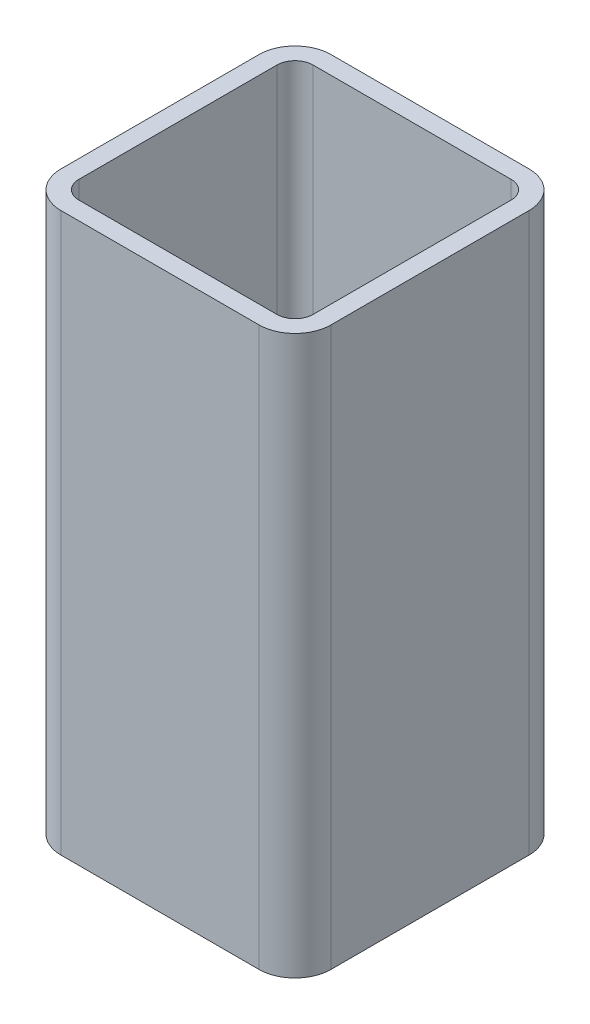
ISO-10303-21;
HEADER;
FILE_DESCRIPTION(('STEP AP214'),'2;1');
FILE_NAME('part.step','',(''),(''),'','','');
FILE_SCHEMA(('AUTOMOTIVE_DESIGN { 1 0 10303 214 1 1 1 1 }'));
ENDSEC;
DATA;
#1=APPLICATION_CONTEXT('core data for automotive mechanical design processes');
#2=APPLICATION_PROTOCOL_DEFINITION('international standard','automotive_design',2000,#1);
#3=PRODUCT_CONTEXT('',#1,'mechanical');
#4=PRODUCT('Part','Part','',(#3));
#5=PRODUCT_RELATED_PRODUCT_CATEGORY('part','',(#4));
#6=PRODUCT_DEFINITION_FORMATION('','',#4);
#7=PRODUCT_DEFINITION_CONTEXT('part definition',#1,'design');
#8=PRODUCT_DEFINITION('design','',#6,#7);
#9=PRODUCT_DEFINITION_SHAPE('','',#8);
#10=(LENGTH_UNIT() NAMED_UNIT(*) SI_UNIT(.MILLI.,.METRE.));
#11=(NAMED_UNIT(*) PLANE_ANGLE_UNIT() SI_UNIT($,.RADIAN.));
#12=(NAMED_UNIT(*) SI_UNIT($,.STERADIAN.) SOLID_ANGLE_UNIT());
#13=UNCERTAINTY_MEASURE_WITH_UNIT(LENGTH_MEASURE(1.E-05),#10,'distance_accuracy_value','');
#14=(GEOMETRIC_REPRESENTATION_CONTEXT(3) GLOBAL_UNCERTAINTY_ASSIGNED_CONTEXT((#13)) GLOBAL_UNIT_ASSIGNED_CONTEXT((#10,
#11,#12)) REPRESENTATION_CONTEXT('',''));
#15=CARTESIAN_POINT('',(0.,0.,0.));
#16=DIRECTION('',(0.,0.,1.));
#17=DIRECTION('',(1.,0.,0.));
#18=AXIS2_PLACEMENT_3D('',#15,#16,#17);
#19=CARTESIAN_POINT('',(4.,62.,-4.));
#20=DIRECTION('',(0.,-1.,0.));
#21=DIRECTION('',(0.,0.,-1.));
#22=AXIS2_PLACEMENT_3D('',#19,#20,#21);
#23=PLANE('',#22);
#24=CARTESIAN_POINT('',(4.,62.,-4.));
#25=DIRECTION('',(0.,1.,0.));
#26=DIRECTION('',(0.,0.,-1.));
#27=AXIS2_PLACEMENT_3D('',#24,#25,#26);
#28=CIRCLE('',#27,4.);
#29=CARTESIAN_POINT('',(0.,62.,-4.00000000000003));
#30=VERTEX_POINT('',#29);
#31=CARTESIAN_POINT('',(4.00000000000003,62.,0.));
#32=VERTEX_POINT('',#31);
#33=EDGE_CURVE('E213',#30,#32,#28,.T.);
#34=ORIENTED_EDGE('',*,*,#33,.T.);
#35=DIRECTION('',(1.,0.,0.));
#36=VECTOR('',#35,1.);
#37=CARTESIAN_POINT('',(4.00000000000003,62.,0.));
#38=LINE('',#37,#36);
#39=CARTESIAN_POINT('',(26.,62.,0.));
#40=VERTEX_POINT('',#39);
#41=EDGE_CURVE('E216',#32,#40,#38,.T.);
#42=ORIENTED_EDGE('',*,*,#41,.T.);
#43=CARTESIAN_POINT('',(26.,62.,-4.));
#44=DIRECTION('',(0.,1.,0.));
#45=DIRECTION('',(0.,0.,1.));
#46=AXIS2_PLACEMENT_3D('',#43,#44,#45);
#47=CIRCLE('',#46,4.);
#48=CARTESIAN_POINT('',(30.,62.,-4.00000000000003));
#49=VERTEX_POINT('',#48);
#50=EDGE_CURVE('E219',#40,#49,#47,.T.);
#51=ORIENTED_EDGE('',*,*,#50,.T.);
#52=DIRECTION('',(0.,0.,-1.));
#53=VECTOR('',#52,1.);
#54=CARTESIAN_POINT('',(30.,62.,-4.00000000000003));
#55=LINE('',#54,#53);
#56=CARTESIAN_POINT('',(30.,62.,-26.));
#57=VERTEX_POINT('',#56);
#58=EDGE_CURVE('E221',#49,#57,#55,.T.);
#59=ORIENTED_EDGE('',*,*,#58,.T.);
#60=CARTESIAN_POINT('',(26.,62.,-26.));
#61=DIRECTION('',(0.,1.,0.));
#62=DIRECTION('',(0.,0.,-1.));
#63=AXIS2_PLACEMENT_3D('',#60,#61,#62);
#64=CIRCLE('',#63,4.);
#65=CARTESIAN_POINT('',(26.,62.,-30.));
#66=VERTEX_POINT('',#65);
#67=EDGE_CURVE('E223',#57,#66,#64,.T.);
#68=ORIENTED_EDGE('',*,*,#67,.T.);
#69=DIRECTION('',(-1.,0.,0.));
#70=VECTOR('',#69,1.);
#71=CARTESIAN_POINT('',(4.00000000000003,62.,-30.));
#72=LINE('',#71,#70);
#73=CARTESIAN_POINT('',(4.00000000000003,62.,-30.));
#74=VERTEX_POINT('',#73);
#75=EDGE_CURVE('E225',#66,#74,#72,.T.);
#76=ORIENTED_EDGE('',*,*,#75,.T.);
#77=CARTESIAN_POINT('',(4.,62.,-26.));
#78=DIRECTION('',(0.,1.,0.));
#79=DIRECTION('',(0.,0.,-1.));
#80=AXIS2_PLACEMENT_3D('',#77,#78,#79);
#81=CIRCLE('',#80,4.);
#82=CARTESIAN_POINT('',(0.,62.,-26.));
#83=VERTEX_POINT('',#82);
#84=EDGE_CURVE('E227',#74,#83,#81,.T.);
#85=ORIENTED_EDGE('',*,*,#84,.T.);
#86=DIRECTION('',(0.,0.,1.));
#87=VECTOR('',#86,1.);
#88=CARTESIAN_POINT('',(0.,62.,-4.00000000000003));
#89=LINE('',#88,#87);
#90=EDGE_CURVE('E229',#83,#30,#89,.T.);
#91=ORIENTED_EDGE('',*,*,#90,.T.);
#92=EDGE_LOOP('',(#34,#42,#51,#59,#68,#76,#85,#91));
#93=FACE_BOUND('',#92,.T.);
#94=CARTESIAN_POINT('',(4.,62.,-4.));
#95=DIRECTION('',(0.,1.,0.));
#96=DIRECTION('',(0.,0.,-1.));
#97=AXIS2_PLACEMENT_3D('',#94,#95,#96);
#98=CIRCLE('',#97,2.);
#99=CARTESIAN_POINT('',(2.,62.,-4.00000000000003));
#100=VERTEX_POINT('',#99);
#101=CARTESIAN_POINT('',(4.00000000000003,62.,-2.));
#102=VERTEX_POINT('',#101);
#103=EDGE_CURVE('E148',#100,#102,#98,.T.);
#104=ORIENTED_EDGE('',*,*,#103,.F.);
#105=DIRECTION('',(0.,0.,1.));
#106=VECTOR('',#105,1.);
#107=CARTESIAN_POINT('',(2.,62.,-4.00000000000003));
#108=LINE('',#107,#106);
#109=CARTESIAN_POINT('',(2.,62.,-26.));
#110=VERTEX_POINT('',#109);
#111=EDGE_CURVE('E181',#110,#100,#108,.T.);
#112=ORIENTED_EDGE('',*,*,#111,.F.);
#113=CARTESIAN_POINT('',(4.,62.,-26.));
#114=DIRECTION('',(0.,1.,0.));
#115=DIRECTION('',(0.,0.,-1.));
#116=AXIS2_PLACEMENT_3D('',#113,#114,#115);
#117=CIRCLE('',#116,2.);
#118=CARTESIAN_POINT('',(4.00000000000003,62.,-28.));
#119=VERTEX_POINT('',#118);
#120=EDGE_CURVE('E179',#119,#110,#117,.T.);
#121=ORIENTED_EDGE('',*,*,#120,.F.);
#122=DIRECTION('',(-1.,0.,0.));
#123=VECTOR('',#122,1.);
#124=CARTESIAN_POINT('',(4.00000000000003,62.,-28.));
#125=LINE('',#124,#123);
#126=CARTESIAN_POINT('',(26.,62.,-28.));
#127=VERTEX_POINT('',#126);
#128=EDGE_CURVE('E177',#127,#119,#125,.T.);
#129=ORIENTED_EDGE('',*,*,#128,.F.);
#130=CARTESIAN_POINT('',(26.,62.,-26.));
#131=DIRECTION('',(0.,1.,0.));
#132=DIRECTION('',(0.,0.,-1.));
#133=AXIS2_PLACEMENT_3D('',#130,#131,#132);
#134=CIRCLE('',#133,2.);
#135=CARTESIAN_POINT('',(28.,62.,-26.));
#136=VERTEX_POINT('',#135);
#137=EDGE_CURVE('E175',#136,#127,#134,.T.);
#138=ORIENTED_EDGE('',*,*,#137,.F.);
#139=DIRECTION('',(0.,0.,-1.));
#140=VECTOR('',#139,1.);
#141=CARTESIAN_POINT('',(28.,62.,-4.00000000000001));
#142=LINE('',#141,#140);
#143=CARTESIAN_POINT('',(28.,62.,-4.00000000000001));
#144=VERTEX_POINT('',#143);
#145=EDGE_CURVE('E171',#144,#136,#142,.T.);
#146=ORIENTED_EDGE('',*,*,#145,.F.);
#147=CARTESIAN_POINT('',(26.,62.,-4.));
#148=DIRECTION('',(0.,1.,0.));
#149=DIRECTION('',(0.,0.,1.));
#150=AXIS2_PLACEMENT_3D('',#147,#148,#149);
#151=CIRCLE('',#150,2.);
#152=CARTESIAN_POINT('',(26.,62.,-2.));
#153=VERTEX_POINT('',#152);
#154=EDGE_CURVE('E169',#153,#144,#151,.T.);
#155=ORIENTED_EDGE('',*,*,#154,.F.);
#156=DIRECTION('',(1.,0.,0.));
#157=VECTOR('',#156,1.);
#158=CARTESIAN_POINT('',(4.00000000000003,62.,-2.));
#159=LINE('',#158,#157);
#160=EDGE_CURVE('E156',#102,#153,#159,.T.);
#161=ORIENTED_EDGE('',*,*,#160,.F.);
#162=EDGE_LOOP('',(#104,#112,#121,#129,#138,#146,#155,#161));
#163=FACE_BOUND('',#162,.T.);
#164=ADVANCED_FACE('F35',(#93,#163),#23,.F.);
#165=CARTESIAN_POINT('',(4.,0.,-4.));
#166=DIRECTION('',(0.,-1.,0.));
#167=DIRECTION('',(0.,0.,-1.));
#168=AXIS2_PLACEMENT_3D('',#165,#166,#167);
#169=PLANE('',#168);
#170=CARTESIAN_POINT('',(4.,0.,-4.));
#171=DIRECTION('',(0.,1.,0.));
#172=DIRECTION('',(0.,0.,-1.));
#173=AXIS2_PLACEMENT_3D('',#170,#171,#172);
#174=CIRCLE('',#173,4.);
#175=CARTESIAN_POINT('',(0.,0.,-4.00000000000003));
#176=VERTEX_POINT('',#175);
#177=CARTESIAN_POINT('',(4.00000000000003,0.,0.));
#178=VERTEX_POINT('',#177);
#179=EDGE_CURVE('E164',#176,#178,#174,.T.);
#180=ORIENTED_EDGE('',*,*,#179,.F.);
#181=DIRECTION('',(0.,0.,1.));
#182=VECTOR('',#181,1.);
#183=CARTESIAN_POINT('',(0.,0.,-4.00000000000003));
#184=LINE('',#183,#182);
#185=CARTESIAN_POINT('',(0.,0.,-26.));
#186=VERTEX_POINT('',#185);
#187=EDGE_CURVE('E217',#186,#176,#184,.T.);
#188=ORIENTED_EDGE('',*,*,#187,.F.);
#189=CARTESIAN_POINT('',(4.,0.,-26.));
#190=DIRECTION('',(0.,1.,0.));
#191=DIRECTION('',(0.,0.,-1.));
#192=AXIS2_PLACEMENT_3D('',#189,#190,#191);
#193=CIRCLE('',#192,4.);
#194=CARTESIAN_POINT('',(4.00000000000003,0.,-30.));
#195=VERTEX_POINT('',#194);
#196=EDGE_CURVE('E244',#195,#186,#193,.T.);
#197=ORIENTED_EDGE('',*,*,#196,.F.);
#198=DIRECTION('',(-1.,0.,0.));
#199=VECTOR('',#198,1.);
#200=CARTESIAN_POINT('',(4.00000000000003,0.,-30.));
#201=LINE('',#200,#199);
#202=CARTESIAN_POINT('',(26.,0.,-30.));
#203=VERTEX_POINT('',#202);
#204=EDGE_CURVE('E242',#203,#195,#201,.T.);
#205=ORIENTED_EDGE('',*,*,#204,.F.);
#206=CARTESIAN_POINT('',(26.,0.,-26.));
#207=DIRECTION('',(0.,1.,0.));
#208=DIRECTION('',(0.,0.,-1.));
#209=AXIS2_PLACEMENT_3D('',#206,#207,#208);
#210=CIRCLE('',#209,4.);
#211=CARTESIAN_POINT('',(30.,0.,-26.));
#212=VERTEX_POINT('',#211);
#213=EDGE_CURVE('E240',#212,#203,#210,.T.);
#214=ORIENTED_EDGE('',*,*,#213,.F.);
#215=DIRECTION('',(0.,0.,-1.));
#216=VECTOR('',#215,1.);
#217=CARTESIAN_POINT('',(30.,0.,-4.00000000000003));
#218=LINE('',#217,#216);
#219=CARTESIAN_POINT('',(30.,0.,-4.00000000000003));
#220=VERTEX_POINT('',#219);
#221=EDGE_CURVE('E238',#220,#212,#218,.T.);
#222=ORIENTED_EDGE('',*,*,#221,.F.);
#223=CARTESIAN_POINT('',(26.,0.,-4.));
#224=DIRECTION('',(0.,1.,0.));
#225=DIRECTION('',(0.,0.,1.));
#226=AXIS2_PLACEMENT_3D('',#223,#224,#225);
#227=CIRCLE('',#226,4.);
#228=CARTESIAN_POINT('',(26.,0.,0.));
#229=VERTEX_POINT('',#228);
#230=EDGE_CURVE('E236',#229,#220,#227,.T.);
#231=ORIENTED_EDGE('',*,*,#230,.F.);
#232=DIRECTION('',(1.,0.,0.));
#233=VECTOR('',#232,1.);
#234=CARTESIAN_POINT('',(4.00000000000003,0.,0.));
#235=LINE('',#234,#233);
#236=EDGE_CURVE('E234',#178,#229,#235,.T.);
#237=ORIENTED_EDGE('',*,*,#236,.F.);
#238=EDGE_LOOP('',(#180,#188,#197,#205,#214,#222,#231,#237));
#239=FACE_BOUND('',#238,.T.);
#240=DIRECTION('',(0.,0.,1.));
#241=VECTOR('',#240,1.);
#242=CARTESIAN_POINT('',(2.,0.,-4.00000000000003));
#243=LINE('',#242,#241);
#244=CARTESIAN_POINT('',(2.,0.,-26.));
#245=VERTEX_POINT('',#244);
#246=CARTESIAN_POINT('',(2.,0.,-4.00000000000003));
#247=VERTEX_POINT('',#246);
#248=EDGE_CURVE('E157',#245,#247,#243,.T.);
#249=ORIENTED_EDGE('',*,*,#248,.T.);
#250=CARTESIAN_POINT('',(4.,0.,-4.));
#251=DIRECTION('',(0.,1.,0.));
#252=DIRECTION('',(0.,0.,-1.));
#253=AXIS2_PLACEMENT_3D('',#250,#251,#252);
#254=CIRCLE('',#253,2.);
#255=CARTESIAN_POINT('',(4.00000000000003,0.,-2.));
#256=VERTEX_POINT('',#255);
#257=EDGE_CURVE('E58',#247,#256,#254,.T.);
#258=ORIENTED_EDGE('',*,*,#257,.T.);
#259=DIRECTION('',(1.,0.,0.));
#260=VECTOR('',#259,1.);
#261=CARTESIAN_POINT('',(4.00000000000003,0.,-2.));
#262=LINE('',#261,#260);
#263=CARTESIAN_POINT('',(26.,0.,-2.));
#264=VERTEX_POINT('',#263);
#265=EDGE_CURVE('E163',#256,#264,#262,.T.);
#266=ORIENTED_EDGE('',*,*,#265,.T.);
#267=CARTESIAN_POINT('',(26.,0.,-4.));
#268=DIRECTION('',(0.,1.,0.));
#269=DIRECTION('',(0.,0.,1.));
#270=AXIS2_PLACEMENT_3D('',#267,#268,#269);
#271=CIRCLE('',#270,2.);
#272=CARTESIAN_POINT('',(28.,0.,-4.00000000000001));
#273=VERTEX_POINT('',#272);
#274=EDGE_CURVE('E185',#264,#273,#271,.T.);
#275=ORIENTED_EDGE('',*,*,#274,.T.);
#276=DIRECTION('',(0.,0.,-1.));
#277=VECTOR('',#276,1.);
#278=CARTESIAN_POINT('',(28.,0.,-4.00000000000001));
#279=LINE('',#278,#277);
#280=CARTESIAN_POINT('',(28.,0.,-26.));
#281=VERTEX_POINT('',#280);
#282=EDGE_CURVE('E188',#273,#281,#279,.T.);
#283=ORIENTED_EDGE('',*,*,#282,.T.);
#284=CARTESIAN_POINT('',(26.,0.,-26.));
#285=DIRECTION('',(0.,1.,0.));
#286=DIRECTION('',(0.,0.,-1.));
#287=AXIS2_PLACEMENT_3D('',#284,#285,#286);
#288=CIRCLE('',#287,2.);
#289=CARTESIAN_POINT('',(26.,0.,-28.));
#290=VERTEX_POINT('',#289);
#291=EDGE_CURVE('E191',#281,#290,#288,.T.);
#292=ORIENTED_EDGE('',*,*,#291,.T.);
#293=DIRECTION('',(-1.,0.,0.));
#294=VECTOR('',#293,1.);
#295=CARTESIAN_POINT('',(4.00000000000003,0.,-28.));
#296=LINE('',#295,#294);
#297=CARTESIAN_POINT('',(4.00000000000003,0.,-28.));
#298=VERTEX_POINT('',#297);
#299=EDGE_CURVE('E194',#290,#298,#296,.T.);
#300=ORIENTED_EDGE('',*,*,#299,.T.);
#301=CARTESIAN_POINT('',(4.,0.,-26.));
#302=DIRECTION('',(0.,1.,0.));
#303=DIRECTION('',(0.,0.,-1.));
#304=AXIS2_PLACEMENT_3D('',#301,#302,#303);
#305=CIRCLE('',#304,2.);
#306=EDGE_CURVE('E197',#298,#245,#305,.T.);
#307=ORIENTED_EDGE('',*,*,#306,.T.);
#308=EDGE_LOOP('',(#249,#258,#266,#275,#283,#292,#300,#307));
#309=FACE_BOUND('',#308,.T.);
#310=ADVANCED_FACE('F274',(#239,#309),#169,.T.);
#311=CARTESIAN_POINT('',(4.,62.,-4.));
#312=DIRECTION('',(0.,-1.,0.));
#313=DIRECTION('',(0.,0.,-1.));
#314=AXIS2_PLACEMENT_3D('',#311,#312,#313);
#315=CYLINDRICAL_SURFACE('',#314,4.);
#316=ORIENTED_EDGE('',*,*,#179,.T.);
#317=DIRECTION('',(0.,-1.,0.));
#318=VECTOR('',#317,1.);
#319=CARTESIAN_POINT('',(4.00000000000003,62.,0.));
#320=LINE('',#319,#318);
#321=EDGE_CURVE('E11',#32,#178,#320,.T.);
#322=ORIENTED_EDGE('',*,*,#321,.F.);
#323=ORIENTED_EDGE('',*,*,#33,.F.);
#324=DIRECTION('',(0.,-1.,0.));
#325=VECTOR('',#324,1.);
#326=CARTESIAN_POINT('',(0.,62.,-4.00000000000003));
#327=LINE('',#326,#325);
#328=EDGE_CURVE('E231',#30,#176,#327,.T.);
#329=ORIENTED_EDGE('',*,*,#328,.T.);
#330=EDGE_LOOP('',(#316,#322,#323,#329));
#331=FACE_BOUND('',#330,.T.);
#332=ADVANCED_FACE('F37',(#331),#315,.T.);
#333=CARTESIAN_POINT('',(4.00000000000003,62.,0.));
#334=DIRECTION('',(0.,0.,-1.));
#335=DIRECTION('',(-1.,0.,0.));
#336=AXIS2_PLACEMENT_3D('',#333,#334,#335);
#337=PLANE('',#336);
#338=ORIENTED_EDGE('',*,*,#236,.T.);
#339=DIRECTION('',(0.,-1.,0.));
#340=VECTOR('',#339,1.);
#341=CARTESIAN_POINT('',(26.,62.,0.));
#342=LINE('',#341,#340);
#343=EDGE_CURVE('E43',#40,#229,#342,.T.);
#344=ORIENTED_EDGE('',*,*,#343,.F.);
#345=ORIENTED_EDGE('',*,*,#41,.F.);
#346=ORIENTED_EDGE('',*,*,#321,.T.);
#347=EDGE_LOOP('',(#338,#344,#345,#346));
#348=FACE_BOUND('',#347,.T.);
#349=ADVANCED_FACE('F291',(#348),#337,.F.);
#350=CARTESIAN_POINT('',(26.,62.,-4.));
#351=DIRECTION('',(0.,-1.,0.));
#352=DIRECTION('',(0.,0.,-1.));
#353=AXIS2_PLACEMENT_3D('',#350,#351,#352);
#354=CYLINDRICAL_SURFACE('',#353,4.);
#355=ORIENTED_EDGE('',*,*,#230,.T.);
#356=DIRECTION('',(0.,-1.,0.));
#357=VECTOR('',#356,1.);
#358=CARTESIAN_POINT('',(30.,62.,-4.00000000000003));
#359=LINE('',#358,#357);
#360=EDGE_CURVE('E261',#49,#220,#359,.T.);
#361=ORIENTED_EDGE('',*,*,#360,.F.);
#362=ORIENTED_EDGE('',*,*,#50,.F.);
#363=ORIENTED_EDGE('',*,*,#343,.T.);
#364=EDGE_LOOP('',(#355,#361,#362,#363));
#365=FACE_BOUND('',#364,.T.);
#366=ADVANCED_FACE('F268',(#365),#354,.T.);
#367=CARTESIAN_POINT('',(30.,62.,-4.00000000000003));
#368=DIRECTION('',(-1.,0.,0.));
#369=DIRECTION('',(0.,0.,1.));
#370=AXIS2_PLACEMENT_3D('',#367,#368,#369);
#371=PLANE('',#370);
#372=ORIENTED_EDGE('',*,*,#221,.T.);
#373=DIRECTION('',(0.,-1.,0.));
#374=VECTOR('',#373,1.);
#375=CARTESIAN_POINT('',(30.,62.,-26.));
#376=LINE('',#375,#374);
#377=EDGE_CURVE('E258',#57,#212,#376,.T.);
#378=ORIENTED_EDGE('',*,*,#377,.F.);
#379=ORIENTED_EDGE('',*,*,#58,.F.);
#380=ORIENTED_EDGE('',*,*,#360,.T.);
#381=EDGE_LOOP('',(#372,#378,#379,#380));
#382=FACE_BOUND('',#381,.T.);
#383=ADVANCED_FACE('F280',(#382),#371,.F.);
#384=CARTESIAN_POINT('',(26.,62.,-26.));
#385=DIRECTION('',(0.,-1.,0.));
#386=DIRECTION('',(0.,0.,-1.));
#387=AXIS2_PLACEMENT_3D('',#384,#385,#386);
#388=CYLINDRICAL_SURFACE('',#387,4.);
#389=ORIENTED_EDGE('',*,*,#213,.T.);
#390=DIRECTION('',(0.,-1.,0.));
#391=VECTOR('',#390,1.);
#392=CARTESIAN_POINT('',(26.,62.,-30.));
#393=LINE('',#392,#391);
#394=EDGE_CURVE('E255',#66,#203,#393,.T.);
#395=ORIENTED_EDGE('',*,*,#394,.F.);
#396=ORIENTED_EDGE('',*,*,#67,.F.);
#397=ORIENTED_EDGE('',*,*,#377,.T.);
#398=EDGE_LOOP('',(#389,#395,#396,#397));
#399=FACE_BOUND('',#398,.T.);
#400=ADVANCED_FACE('F284',(#399),#388,.T.);
#401=CARTESIAN_POINT('',(4.00000000000003,62.,-30.));
#402=DIRECTION('',(0.,0.,1.));
#403=DIRECTION('',(1.,0.,0.));
#404=AXIS2_PLACEMENT_3D('',#401,#402,#403);
#405=PLANE('',#404);
#406=ORIENTED_EDGE('',*,*,#204,.T.);
#407=DIRECTION('',(0.,-1.,0.));
#408=VECTOR('',#407,1.);
#409=CARTESIAN_POINT('',(4.00000000000003,62.,-30.));
#410=LINE('',#409,#408);
#411=EDGE_CURVE('E252',#74,#195,#410,.T.);
#412=ORIENTED_EDGE('',*,*,#411,.F.);
#413=ORIENTED_EDGE('',*,*,#75,.F.);
#414=ORIENTED_EDGE('',*,*,#394,.T.);
#415=EDGE_LOOP('',(#406,#412,#413,#414));
#416=FACE_BOUND('',#415,.T.);
#417=ADVANCED_FACE('F304',(#416),#405,.F.);
#418=CARTESIAN_POINT('',(4.,62.,-26.));
#419=DIRECTION('',(0.,-1.,0.));
#420=DIRECTION('',(0.,0.,-1.));
#421=AXIS2_PLACEMENT_3D('',#418,#419,#420);
#422=CYLINDRICAL_SURFACE('',#421,4.);
#423=ORIENTED_EDGE('',*,*,#196,.T.);
#424=DIRECTION('',(0.,-1.,0.));
#425=VECTOR('',#424,1.);
#426=CARTESIAN_POINT('',(0.,62.,-26.));
#427=LINE('',#426,#425);
#428=EDGE_CURVE('E249',#83,#186,#427,.T.);
#429=ORIENTED_EDGE('',*,*,#428,.F.);
#430=ORIENTED_EDGE('',*,*,#84,.F.);
#431=ORIENTED_EDGE('',*,*,#411,.T.);
#432=EDGE_LOOP('',(#423,#429,#430,#431));
#433=FACE_BOUND('',#432,.T.);
#434=ADVANCED_FACE('F302',(#433),#422,.T.);
#435=CARTESIAN_POINT('',(0.,62.,-4.00000000000003));
#436=DIRECTION('',(1.,0.,0.));
#437=DIRECTION('',(0.,0.,-1.));
#438=AXIS2_PLACEMENT_3D('',#435,#436,#437);
#439=PLANE('',#438);
#440=ORIENTED_EDGE('',*,*,#187,.T.);
#441=ORIENTED_EDGE('',*,*,#328,.F.);
#442=ORIENTED_EDGE('',*,*,#90,.F.);
#443=ORIENTED_EDGE('',*,*,#428,.T.);
#444=EDGE_LOOP('',(#440,#441,#442,#443));
#445=FACE_BOUND('',#444,.T.);
#446=ADVANCED_FACE('F297',(#445),#439,.F.);
#447=CARTESIAN_POINT('',(4.,62.,-4.));
#448=DIRECTION('',(0.,-1.,0.));
#449=DIRECTION('',(0.,0.,-1.));
#450=AXIS2_PLACEMENT_3D('',#447,#448,#449);
#451=CYLINDRICAL_SURFACE('',#450,2.);
#452=ORIENTED_EDGE('',*,*,#257,.F.);
#453=DIRECTION('',(0.,-1.,0.));
#454=VECTOR('',#453,1.);
#455=CARTESIAN_POINT('',(2.,62.,-4.00000000000003));
#456=LINE('',#455,#454);
#457=EDGE_CURVE('E152',#100,#247,#456,.T.);
#458=ORIENTED_EDGE('',*,*,#457,.F.);
#459=ORIENTED_EDGE('',*,*,#103,.T.);
#460=DIRECTION('',(0.,-1.,0.));
#461=VECTOR('',#460,1.);
#462=CARTESIAN_POINT('',(4.00000000000003,62.,-2.));
#463=LINE('',#462,#461);
#464=EDGE_CURVE('E151',#102,#256,#463,.T.);
#465=ORIENTED_EDGE('',*,*,#464,.T.);
#466=EDGE_LOOP('',(#452,#458,#459,#465));
#467=FACE_BOUND('',#466,.T.);
#468=ADVANCED_FACE('F150',(#467),#451,.F.);
#469=CARTESIAN_POINT('',(4.00000000000003,62.,-2.));
#470=DIRECTION('',(0.,0.,-1.));
#471=DIRECTION('',(-1.,0.,0.));
#472=AXIS2_PLACEMENT_3D('',#469,#470,#471);
#473=PLANE('',#472);
#474=ORIENTED_EDGE('',*,*,#265,.F.);
#475=ORIENTED_EDGE('',*,*,#464,.F.);
#476=ORIENTED_EDGE('',*,*,#160,.T.);
#477=DIRECTION('',(0.,-1.,0.));
#478=VECTOR('',#477,1.);
#479=CARTESIAN_POINT('',(26.,62.,-2.));
#480=LINE('',#479,#478);
#481=EDGE_CURVE('E165',#153,#264,#480,.T.);
#482=ORIENTED_EDGE('',*,*,#481,.T.);
#483=EDGE_LOOP('',(#474,#475,#476,#482));
#484=FACE_BOUND('',#483,.T.);
#485=ADVANCED_FACE('F160',(#484),#473,.T.);
#486=CARTESIAN_POINT('',(26.,62.,-4.));
#487=DIRECTION('',(0.,-1.,0.));
#488=DIRECTION('',(0.,0.,-1.));
#489=AXIS2_PLACEMENT_3D('',#486,#487,#488);
#490=CYLINDRICAL_SURFACE('',#489,2.);
#491=ORIENTED_EDGE('',*,*,#274,.F.);
#492=ORIENTED_EDGE('',*,*,#481,.F.);
#493=ORIENTED_EDGE('',*,*,#154,.T.);
#494=DIRECTION('',(0.,-1.,0.));
#495=VECTOR('',#494,1.);
#496=CARTESIAN_POINT('',(28.,62.,-4.00000000000001));
#497=LINE('',#496,#495);
#498=EDGE_CURVE('E210',#144,#273,#497,.T.);
#499=ORIENTED_EDGE('',*,*,#498,.T.);
#500=EDGE_LOOP('',(#491,#492,#493,#499));
#501=FACE_BOUND('',#500,.T.);
#502=ADVANCED_FACE('F329',(#501),#490,.F.);
#503=CARTESIAN_POINT('',(28.,62.,-4.00000000000001));
#504=DIRECTION('',(-1.,0.,0.));
#505=DIRECTION('',(0.,0.,1.));
#506=AXIS2_PLACEMENT_3D('',#503,#504,#505);
#507=PLANE('',#506);
#508=ORIENTED_EDGE('',*,*,#282,.F.);
#509=ORIENTED_EDGE('',*,*,#498,.F.);
#510=ORIENTED_EDGE('',*,*,#145,.T.);
#511=DIRECTION('',(0.,-1.,0.));
#512=VECTOR('',#511,1.);
#513=CARTESIAN_POINT('',(28.,62.,-26.));
#514=LINE('',#513,#512);
#515=EDGE_CURVE('E208',#136,#281,#514,.T.);
#516=ORIENTED_EDGE('',*,*,#515,.T.);
#517=EDGE_LOOP('',(#508,#509,#510,#516));
#518=FACE_BOUND('',#517,.T.);
#519=ADVANCED_FACE('F333',(#518),#507,.T.);
#520=CARTESIAN_POINT('',(26.,62.,-26.));
#521=DIRECTION('',(0.,-1.,0.));
#522=DIRECTION('',(0.,0.,-1.));
#523=AXIS2_PLACEMENT_3D('',#520,#521,#522);
#524=CYLINDRICAL_SURFACE('',#523,2.);
#525=ORIENTED_EDGE('',*,*,#291,.F.);
#526=ORIENTED_EDGE('',*,*,#515,.F.);
#527=ORIENTED_EDGE('',*,*,#137,.T.);
#528=DIRECTION('',(0.,-1.,0.));
#529=VECTOR('',#528,1.);
#530=CARTESIAN_POINT('',(26.,62.,-28.));
#531=LINE('',#530,#529);
#532=EDGE_CURVE('E206',#127,#290,#531,.T.);
#533=ORIENTED_EDGE('',*,*,#532,.T.);
#534=EDGE_LOOP('',(#525,#526,#527,#533));
#535=FACE_BOUND('',#534,.T.);
#536=ADVANCED_FACE('F339',(#535),#524,.F.);
#537=CARTESIAN_POINT('',(4.00000000000003,62.,-28.));
#538=DIRECTION('',(0.,0.,1.));
#539=DIRECTION('',(1.,0.,0.));
#540=AXIS2_PLACEMENT_3D('',#537,#538,#539);
#541=PLANE('',#540);
#542=ORIENTED_EDGE('',*,*,#299,.F.);
#543=ORIENTED_EDGE('',*,*,#532,.F.);
#544=ORIENTED_EDGE('',*,*,#128,.T.);
#545=DIRECTION('',(0.,-1.,0.));
#546=VECTOR('',#545,1.);
#547=CARTESIAN_POINT('',(4.00000000000003,62.,-28.));
#548=LINE('',#547,#546);
#549=EDGE_CURVE('E204',#119,#298,#548,.T.);
#550=ORIENTED_EDGE('',*,*,#549,.T.);
#551=EDGE_LOOP('',(#542,#543,#544,#550));
#552=FACE_BOUND('',#551,.T.);
#553=ADVANCED_FACE('F343',(#552),#541,.T.);
#554=CARTESIAN_POINT('',(4.,62.,-26.));
#555=DIRECTION('',(0.,-1.,0.));
#556=DIRECTION('',(0.,0.,-1.));
#557=AXIS2_PLACEMENT_3D('',#554,#555,#556);
#558=CYLINDRICAL_SURFACE('',#557,2.);
#559=ORIENTED_EDGE('',*,*,#306,.F.);
#560=ORIENTED_EDGE('',*,*,#549,.F.);
#561=ORIENTED_EDGE('',*,*,#120,.T.);
#562=DIRECTION('',(0.,-1.,0.));
#563=VECTOR('',#562,1.);
#564=CARTESIAN_POINT('',(2.,62.,-26.));
#565=LINE('',#564,#563);
#566=EDGE_CURVE('E50',#110,#245,#565,.T.);
#567=ORIENTED_EDGE('',*,*,#566,.T.);
#568=EDGE_LOOP('',(#559,#560,#561,#567));
#569=FACE_BOUND('',#568,.T.);
#570=ADVANCED_FACE('F347',(#569),#558,.F.);
#571=CARTESIAN_POINT('',(2.,62.,-4.00000000000003));
#572=DIRECTION('',(1.,0.,0.));
#573=DIRECTION('',(0.,0.,-1.));
#574=AXIS2_PLACEMENT_3D('',#571,#572,#573);
#575=PLANE('',#574);
#576=ORIENTED_EDGE('',*,*,#248,.F.);
#577=ORIENTED_EDGE('',*,*,#566,.F.);
#578=ORIENTED_EDGE('',*,*,#111,.T.);
#579=ORIENTED_EDGE('',*,*,#457,.T.);
#580=EDGE_LOOP('',(#576,#577,#578,#579));
#581=FACE_BOUND('',#580,.T.);
#582=ADVANCED_FACE('F351',(#581),#575,.T.);
#583=CLOSED_SHELL('',(#164,#310,#332,#349,#366,#383,#400,#417,#434,#446,#468,#485,#502,#519,
#536,#553,#570,#582));
#584=MANIFOLD_SOLID_BREP('B2',#583);
#585=ADVANCED_BREP_SHAPE_REPRESENTATION('',(#18,#584),#14);
#586=SHAPE_DEFINITION_REPRESENTATION(#9,#585);
ENDSEC;
END-ISO-10303-21;
